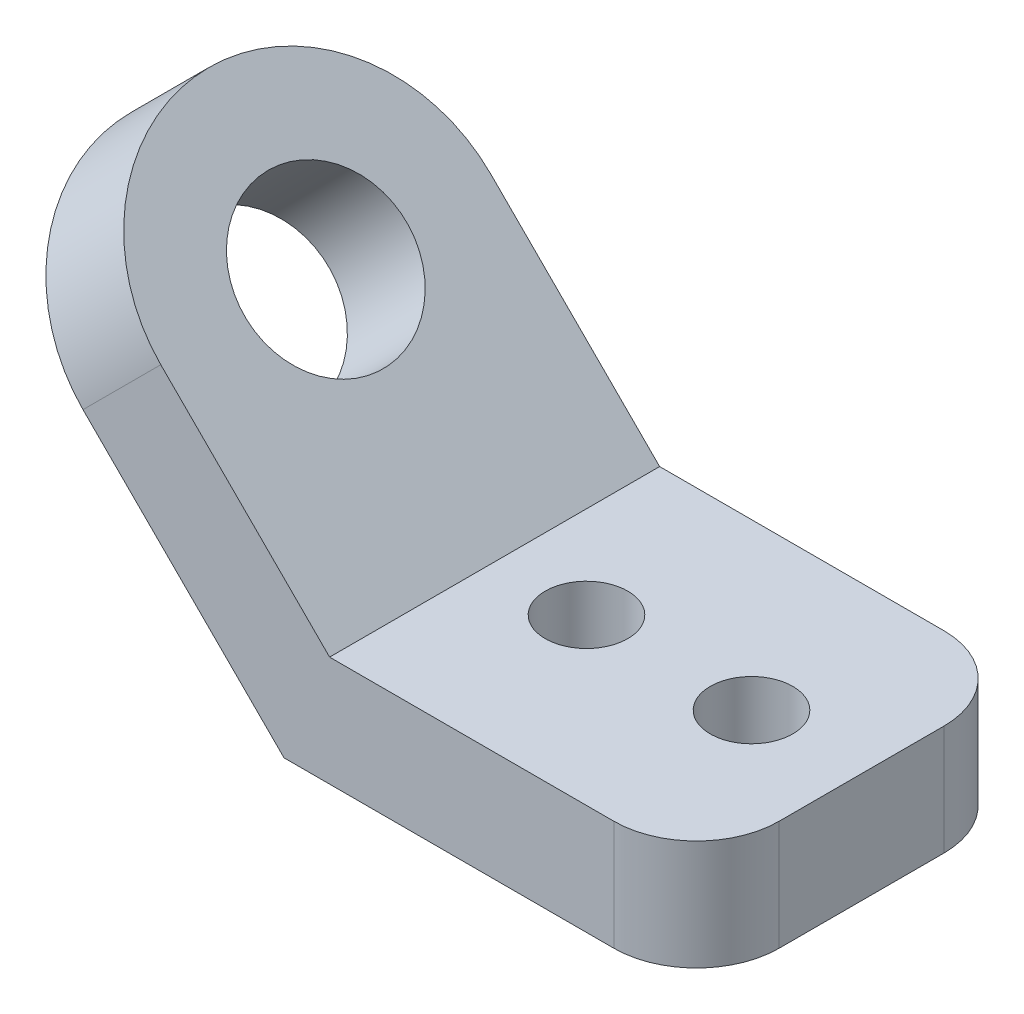
ISO-10303-21;
HEADER;
FILE_DESCRIPTION(('STEP AP214'),'2;1');
FILE_NAME('part.step','',(''),(''),'','','');
FILE_SCHEMA(('AUTOMOTIVE_DESIGN { 1 0 10303 214 1 1 1 1 }'));
ENDSEC;
DATA;
#1=APPLICATION_CONTEXT('core data for automotive mechanical design processes');
#2=APPLICATION_PROTOCOL_DEFINITION('international standard','automotive_design',2000,#1);
#3=PRODUCT_CONTEXT('',#1,'mechanical');
#4=PRODUCT('Part','Part','',(#3));
#5=PRODUCT_RELATED_PRODUCT_CATEGORY('part','',(#4));
#6=PRODUCT_DEFINITION_FORMATION('','',#4);
#7=PRODUCT_DEFINITION_CONTEXT('part definition',#1,'design');
#8=PRODUCT_DEFINITION('design','',#6,#7);
#9=PRODUCT_DEFINITION_SHAPE('','',#8);
#10=(LENGTH_UNIT() NAMED_UNIT(*) SI_UNIT(.MILLI.,.METRE.));
#11=(NAMED_UNIT(*) PLANE_ANGLE_UNIT() SI_UNIT($,.RADIAN.));
#12=(NAMED_UNIT(*) SI_UNIT($,.STERADIAN.) SOLID_ANGLE_UNIT());
#13=UNCERTAINTY_MEASURE_WITH_UNIT(LENGTH_MEASURE(1.E-05),#10,'distance_accuracy_value','');
#14=(GEOMETRIC_REPRESENTATION_CONTEXT(3) GLOBAL_UNCERTAINTY_ASSIGNED_CONTEXT((#13)) GLOBAL_UNIT_ASSIGNED_CONTEXT((#10,
#11,#12)) REPRESENTATION_CONTEXT('',''));
#15=CARTESIAN_POINT('',(0.,0.,0.));
#16=DIRECTION('',(0.,0.,1.));
#17=DIRECTION('',(1.,0.,0.));
#18=AXIS2_PLACEMENT_3D('',#15,#16,#17);
#19=CARTESIAN_POINT('',(0.,2.,3.));
#20=DIRECTION('',(-1.,0.,0.));
#21=DIRECTION('',(0.,0.,1.));
#22=AXIS2_PLACEMENT_3D('',#19,#20,#21);
#23=PLANE('',#22);
#24=DIRECTION('',(0.,0.,-1.));
#25=VECTOR('',#24,1.);
#26=CARTESIAN_POINT('',(0.,0.,3.));
#27=LINE('',#26,#25);
#28=CARTESIAN_POINT('',(0.,0.,1.5));
#29=VERTEX_POINT('',#28);
#30=CARTESIAN_POINT('',(0.,0.,-1.5));
#31=VERTEX_POINT('',#30);
#32=EDGE_CURVE('E145',#29,#31,#27,.T.);
#33=ORIENTED_EDGE('',*,*,#32,.T.);
#34=DIRECTION('',(0.,1.,0.));
#35=VECTOR('',#34,1.);
#36=CARTESIAN_POINT('',(0.,2.,-1.5));
#37=LINE('',#36,#35);
#38=CARTESIAN_POINT('',(0.,2.,-1.5));
#39=VERTEX_POINT('',#38);
#40=EDGE_CURVE('E174',#31,#39,#37,.T.);
#41=ORIENTED_EDGE('',*,*,#40,.T.);
#42=DIRECTION('',(0.,0.,-1.));
#43=VECTOR('',#42,1.);
#44=CARTESIAN_POINT('',(0.,2.,3.));
#45=LINE('',#44,#43);
#46=CARTESIAN_POINT('',(0.,2.,1.5));
#47=VERTEX_POINT('',#46);
#48=EDGE_CURVE('E132',#47,#39,#45,.T.);
#49=ORIENTED_EDGE('',*,*,#48,.F.);
#50=DIRECTION('',(0.,1.,0.));
#51=VECTOR('',#50,1.);
#52=CARTESIAN_POINT('',(0.,2.,1.5));
#53=LINE('',#52,#51);
#54=EDGE_CURVE('E170',#47,#29,#53,.F.);
#55=ORIENTED_EDGE('',*,*,#54,.T.);
#56=EDGE_LOOP('',(#33,#41,#49,#55));
#57=FACE_BOUND('',#56,.T.);
#58=ADVANCED_FACE('F38',(#57),#23,.F.);
#59=CARTESIAN_POINT('',(0.,2.,3.));
#60=DIRECTION('',(0.,-1.,0.));
#61=DIRECTION('',(1.,0.,0.));
#62=AXIS2_PLACEMENT_3D('',#59,#60,#61);
#63=PLANE('',#62);
#64=CARTESIAN_POINT('',(-5.,2.,0.));
#65=DIRECTION('',(0.,1.,0.));
#66=DIRECTION('',(-1.,0.,0.));
#67=AXIS2_PLACEMENT_3D('',#64,#65,#66);
#68=CIRCLE('',#67,0.749999999999999);
#69=CARTESIAN_POINT('',(-5.75,2.,0.));
#70=VERTEX_POINT('',#69);
#71=EDGE_CURVE('E251',#70,#70,#68,.T.);
#72=ORIENTED_EDGE('',*,*,#71,.F.);
#73=EDGE_LOOP('',(#72));
#74=FACE_BOUND('',#73,.T.);
#75=CARTESIAN_POINT('',(-2.,2.,0.));
#76=DIRECTION('',(0.,1.,0.));
#77=DIRECTION('',(-1.,0.,0.));
#78=AXIS2_PLACEMENT_3D('',#75,#76,#77);
#79=CIRCLE('',#78,0.750000000000001);
#80=CARTESIAN_POINT('',(-2.75,2.,0.));
#81=VERTEX_POINT('',#80);
#82=EDGE_CURVE('E254',#81,#81,#79,.T.);
#83=ORIENTED_EDGE('',*,*,#82,.F.);
#84=EDGE_LOOP('',(#83));
#85=FACE_BOUND('',#84,.T.);
#86=ORIENTED_EDGE('',*,*,#48,.T.);
#87=CARTESIAN_POINT('',(-1.5,2.,-1.5));
#88=DIRECTION('',(0.,-1.,0.));
#89=DIRECTION('',(1.,0.,0.));
#90=AXIS2_PLACEMENT_3D('',#87,#88,#89);
#91=CIRCLE('',#90,1.5);
#92=CARTESIAN_POINT('',(-1.5,2.,-3.));
#93=VERTEX_POINT('',#92);
#94=EDGE_CURVE('E179',#39,#93,#91,.F.);
#95=ORIENTED_EDGE('',*,*,#94,.T.);
#96=DIRECTION('',(-1.,0.,0.));
#97=VECTOR('',#96,1.);
#98=CARTESIAN_POINT('',(0.,2.,-3.));
#99=LINE('',#98,#97);
#100=CARTESIAN_POINT('',(-6.67,2.,-3.));
#101=VERTEX_POINT('',#100);
#102=EDGE_CURVE('E128',#93,#101,#99,.T.);
#103=ORIENTED_EDGE('',*,*,#102,.T.);
#104=DIRECTION('',(0.,0.,-1.));
#105=VECTOR('',#104,1.);
#106=CARTESIAN_POINT('',(-6.67,2.,3.));
#107=LINE('',#106,#105);
#108=CARTESIAN_POINT('',(-6.67,2.,3.));
#109=VERTEX_POINT('',#108);
#110=EDGE_CURVE('E125',#109,#101,#107,.T.);
#111=ORIENTED_EDGE('',*,*,#110,.F.);
#112=DIRECTION('',(-1.,0.,0.));
#113=VECTOR('',#112,1.);
#114=CARTESIAN_POINT('',(0.,2.,3.));
#115=LINE('',#114,#113);
#116=CARTESIAN_POINT('',(-1.5,2.,3.));
#117=VERTEX_POINT('',#116);
#118=EDGE_CURVE('E114',#117,#109,#115,.T.);
#119=ORIENTED_EDGE('',*,*,#118,.F.);
#120=CARTESIAN_POINT('',(-1.5,2.,1.5));
#121=DIRECTION('',(0.,-1.,0.));
#122=DIRECTION('',(1.,0.,0.));
#123=AXIS2_PLACEMENT_3D('',#120,#121,#122);
#124=CIRCLE('',#123,1.5);
#125=EDGE_CURVE('E177',#117,#47,#124,.F.);
#126=ORIENTED_EDGE('',*,*,#125,.T.);
#127=EDGE_LOOP('',(#86,#95,#103,#111,#119,#126));
#128=FACE_BOUND('',#127,.T.);
#129=ADVANCED_FACE('F127',(#74,#85,#128),#63,.F.);
#130=CARTESIAN_POINT('',(-6.67,2.,3.));
#131=DIRECTION('',(-0.707106781186548,-0.707106781186547,0.));
#132=DIRECTION('',(0.707106781186547,-0.707106781186548,0.));
#133=AXIS2_PLACEMENT_3D('',#130,#131,#132);
#134=PLANE('',#133);
#135=CARTESIAN_POINT('',(-9.73884343034961,5.06884343034962,0.));
#136=DIRECTION('',(0.707106781186548,0.707106781186547,0.));
#137=DIRECTION('',(-0.707106781186547,0.707106781186548,0.));
#138=AXIS2_PLACEMENT_3D('',#135,#136,#137);
#139=CIRCLE('',#138,1.475);
#140=CARTESIAN_POINT('',(-10.7818259325998,6.11182593259978,0.));
#141=VERTEX_POINT('',#140);
#142=EDGE_CURVE('E247',#141,#141,#139,.T.);
#143=ORIENTED_EDGE('',*,*,#142,.F.);
#144=EDGE_LOOP('',(#143));
#145=FACE_BOUND('',#144,.T.);
#146=DIRECTION('',(-0.707106781186547,0.707106781186549,0.));
#147=VECTOR('',#146,1.);
#148=CARTESIAN_POINT('',(-6.67,2.,-3.));
#149=LINE('',#148,#147);
#150=CARTESIAN_POINT('',(-9.73884343034961,5.06884343034962,-3.));
#151=VERTEX_POINT('',#150);
#152=EDGE_CURVE('E147',#101,#151,#149,.T.);
#153=ORIENTED_EDGE('',*,*,#152,.T.);
#154=CARTESIAN_POINT('',(-9.73884343034961,5.06884343034962,0.));
#155=DIRECTION('',(-0.707106781186548,-0.707106781186547,0.));
#156=DIRECTION('',(0.707106781186547,-0.707106781186548,0.));
#157=AXIS2_PLACEMENT_3D('',#154,#155,#156);
#158=CIRCLE('',#157,3.);
#159=CARTESIAN_POINT('',(-11.8601637739093,7.19016377390926,0.));
#160=VERTEX_POINT('',#159);
#161=EDGE_CURVE('E166',#151,#160,#158,.F.);
#162=ORIENTED_EDGE('',*,*,#161,.T.);
#163=CARTESIAN_POINT('',(-9.73884343034961,5.06884343034962,0.));
#164=DIRECTION('',(-0.707106781186548,-0.707106781186547,0.));
#165=DIRECTION('',(0.707106781186547,-0.707106781186548,0.));
#166=AXIS2_PLACEMENT_3D('',#163,#164,#165);
#167=CIRCLE('',#166,3.);
#168=CARTESIAN_POINT('',(-9.73884343034961,5.06884343034962,3.));
#169=VERTEX_POINT('',#168);
#170=EDGE_CURVE('E137',#160,#169,#167,.F.);
#171=ORIENTED_EDGE('',*,*,#170,.T.);
#172=DIRECTION('',(-0.707106781186547,0.707106781186549,0.));
#173=VECTOR('',#172,1.);
#174=CARTESIAN_POINT('',(-6.67,2.,3.));
#175=LINE('',#174,#173);
#176=EDGE_CURVE('E118',#109,#169,#175,.T.);
#177=ORIENTED_EDGE('',*,*,#176,.F.);
#178=ORIENTED_EDGE('',*,*,#110,.T.);
#179=EDGE_LOOP('',(#153,#162,#171,#177,#178));
#180=FACE_BOUND('',#179,.T.);
#181=ADVANCED_FACE('F135',(#145,#180),#134,.F.);
#182=CARTESIAN_POINT('',(-7.49842712474619,0.,3.));
#183=DIRECTION('',(0.707106781186548,0.707106781186546,0.));
#184=DIRECTION('',(-0.707106781186546,0.707106781186549,0.));
#185=AXIS2_PLACEMENT_3D('',#182,#183,#184);
#186=PLANE('',#185);
#187=CARTESIAN_POINT('',(-11.1530569927227,3.65462986797652,0.));
#188=DIRECTION('',(0.707106781186548,0.707106781186546,0.));
#189=DIRECTION('',(-0.707106781186546,0.707106781186549,0.));
#190=AXIS2_PLACEMENT_3D('',#187,#188,#189);
#191=CIRCLE('',#190,1.475);
#192=CARTESIAN_POINT('',(-12.1960394949729,4.69761237022668,0.));
#193=VERTEX_POINT('',#192);
#194=EDGE_CURVE('E42',#193,#193,#191,.T.);
#195=ORIENTED_EDGE('',*,*,#194,.T.);
#196=EDGE_LOOP('',(#195));
#197=FACE_BOUND('',#196,.T.);
#198=CARTESIAN_POINT('',(-11.1530569927227,3.65462986797653,0.));
#199=DIRECTION('',(0.707106781186548,0.707106781186546,0.));
#200=DIRECTION('',(-0.707106781186546,0.707106781186549,0.));
#201=AXIS2_PLACEMENT_3D('',#198,#199,#200);
#202=CIRCLE('',#201,3.);
#203=CARTESIAN_POINT('',(-11.1530569927227,3.65462986797653,3.));
#204=VERTEX_POINT('',#203);
#205=CARTESIAN_POINT('',(-13.2743773362823,5.77595021153617,0.));
#206=VERTEX_POINT('',#205);
#207=EDGE_CURVE('E158',#204,#206,#202,.F.);
#208=ORIENTED_EDGE('',*,*,#207,.T.);
#209=CARTESIAN_POINT('',(-11.1530569927227,3.65462986797653,0.));
#210=DIRECTION('',(0.707106781186548,0.707106781186546,0.));
#211=DIRECTION('',(-0.707106781186546,0.707106781186549,0.));
#212=AXIS2_PLACEMENT_3D('',#209,#210,#211);
#213=CIRCLE('',#212,3.);
#214=CARTESIAN_POINT('',(-11.1530569927227,3.65462986797653,-3.));
#215=VERTEX_POINT('',#214);
#216=EDGE_CURVE('E160',#206,#215,#213,.F.);
#217=ORIENTED_EDGE('',*,*,#216,.T.);
#218=DIRECTION('',(0.707106781186546,-0.707106781186549,0.));
#219=VECTOR('',#218,1.);
#220=CARTESIAN_POINT('',(-7.49842712474619,0.,-3.));
#221=LINE('',#220,#219);
#222=CARTESIAN_POINT('',(-7.49842712474619,0.,-3.));
#223=VERTEX_POINT('',#222);
#224=EDGE_CURVE('E150',#215,#223,#221,.T.);
#225=ORIENTED_EDGE('',*,*,#224,.T.);
#226=DIRECTION('',(0.,0.,-1.));
#227=VECTOR('',#226,1.);
#228=CARTESIAN_POINT('',(-7.49842712474619,0.,3.));
#229=LINE('',#228,#227);
#230=CARTESIAN_POINT('',(-7.49842712474619,0.,3.));
#231=VERTEX_POINT('',#230);
#232=EDGE_CURVE('E133',#231,#223,#229,.T.);
#233=ORIENTED_EDGE('',*,*,#232,.F.);
#234=DIRECTION('',(0.707106781186546,-0.707106781186549,0.));
#235=VECTOR('',#234,1.);
#236=CARTESIAN_POINT('',(-7.49842712474619,0.,3.));
#237=LINE('',#236,#235);
#238=EDGE_CURVE('E138',#204,#231,#237,.T.);
#239=ORIENTED_EDGE('',*,*,#238,.F.);
#240=EDGE_LOOP('',(#208,#217,#225,#233,#239));
#241=FACE_BOUND('',#240,.T.);
#242=ADVANCED_FACE('F202',(#197,#241),#186,.F.);
#243=CARTESIAN_POINT('',(0.,0.,3.));
#244=DIRECTION('',(0.,1.,0.));
#245=DIRECTION('',(-1.,0.,0.));
#246=AXIS2_PLACEMENT_3D('',#243,#244,#245);
#247=PLANE('',#246);
#248=CARTESIAN_POINT('',(-5.,0.,0.));
#249=DIRECTION('',(0.,1.,0.));
#250=DIRECTION('',(-1.,0.,0.));
#251=AXIS2_PLACEMENT_3D('',#248,#249,#250);
#252=CIRCLE('',#251,0.749999999999999);
#253=CARTESIAN_POINT('',(-5.75,0.,0.));
#254=VERTEX_POINT('',#253);
#255=EDGE_CURVE('E248',#254,#254,#252,.T.);
#256=ORIENTED_EDGE('',*,*,#255,.T.);
#257=EDGE_LOOP('',(#256));
#258=FACE_BOUND('',#257,.T.);
#259=CARTESIAN_POINT('',(-2.,0.,0.));
#260=DIRECTION('',(0.,1.,0.));
#261=DIRECTION('',(-1.,0.,0.));
#262=AXIS2_PLACEMENT_3D('',#259,#260,#261);
#263=CIRCLE('',#262,0.750000000000001);
#264=CARTESIAN_POINT('',(-2.75,0.,0.));
#265=VERTEX_POINT('',#264);
#266=EDGE_CURVE('E257',#265,#265,#263,.T.);
#267=ORIENTED_EDGE('',*,*,#266,.T.);
#268=EDGE_LOOP('',(#267));
#269=FACE_BOUND('',#268,.T.);
#270=DIRECTION('',(1.,0.,0.));
#271=VECTOR('',#270,1.);
#272=CARTESIAN_POINT('',(0.,0.,-3.));
#273=LINE('',#272,#271);
#274=CARTESIAN_POINT('',(-1.5,0.,-3.));
#275=VERTEX_POINT('',#274);
#276=EDGE_CURVE('E122',#223,#275,#273,.T.);
#277=ORIENTED_EDGE('',*,*,#276,.T.);
#278=CARTESIAN_POINT('',(-1.5,0.,-1.5));
#279=DIRECTION('',(0.,1.,0.));
#280=DIRECTION('',(-1.,0.,0.));
#281=AXIS2_PLACEMENT_3D('',#278,#279,#280);
#282=CIRCLE('',#281,1.5);
#283=EDGE_CURVE('E47',#275,#31,#282,.F.);
#284=ORIENTED_EDGE('',*,*,#283,.T.);
#285=ORIENTED_EDGE('',*,*,#32,.F.);
#286=CARTESIAN_POINT('',(-1.5,0.,1.5));
#287=DIRECTION('',(0.,1.,0.));
#288=DIRECTION('',(-1.,0.,0.));
#289=AXIS2_PLACEMENT_3D('',#286,#287,#288);
#290=CIRCLE('',#289,1.5);
#291=CARTESIAN_POINT('',(-1.5,0.,3.));
#292=VERTEX_POINT('',#291);
#293=EDGE_CURVE('E54',#29,#292,#290,.F.);
#294=ORIENTED_EDGE('',*,*,#293,.T.);
#295=DIRECTION('',(1.,0.,0.));
#296=VECTOR('',#295,1.);
#297=CARTESIAN_POINT('',(0.,0.,3.));
#298=LINE('',#297,#296);
#299=EDGE_CURVE('E140',#231,#292,#298,.T.);
#300=ORIENTED_EDGE('',*,*,#299,.F.);
#301=ORIENTED_EDGE('',*,*,#232,.T.);
#302=EDGE_LOOP('',(#277,#284,#285,#294,#300,#301));
#303=FACE_BOUND('',#302,.T.);
#304=ADVANCED_FACE('F184',(#258,#269,#303),#247,.F.);
#305=CARTESIAN_POINT('',(0.,0.,3.));
#306=DIRECTION('',(0.,0.,-1.));
#307=DIRECTION('',(-1.,0.,0.));
#308=AXIS2_PLACEMENT_3D('',#305,#306,#307);
#309=PLANE('',#308);
#310=ORIENTED_EDGE('',*,*,#299,.T.);
#311=DIRECTION('',(0.,1.,0.));
#312=VECTOR('',#311,1.);
#313=CARTESIAN_POINT('',(-1.5,0.,3.));
#314=LINE('',#313,#312);
#315=EDGE_CURVE('E11',#292,#117,#314,.T.);
#316=ORIENTED_EDGE('',*,*,#315,.T.);
#317=ORIENTED_EDGE('',*,*,#118,.T.);
#318=ORIENTED_EDGE('',*,*,#176,.T.);
#319=DIRECTION('',(-0.707106781186549,-0.707106781186546,0.));
#320=VECTOR('',#319,1.);
#321=CARTESIAN_POINT('',(-7.40384343034959,7.40384343034962,3.));
#322=LINE('',#321,#320);
#323=EDGE_CURVE('E168',#169,#204,#322,.T.);
#324=ORIENTED_EDGE('',*,*,#323,.T.);
#325=ORIENTED_EDGE('',*,*,#238,.T.);
#326=EDGE_LOOP('',(#310,#316,#317,#318,#324,#325));
#327=FACE_BOUND('',#326,.T.);
#328=ADVANCED_FACE('F116',(#327),#309,.F.);
#329=CARTESIAN_POINT('',(0.,0.,-3.));
#330=DIRECTION('',(0.,0.,-1.));
#331=DIRECTION('',(-1.,0.,0.));
#332=AXIS2_PLACEMENT_3D('',#329,#330,#331);
#333=PLANE('',#332);
#334=ORIENTED_EDGE('',*,*,#102,.F.);
#335=DIRECTION('',(0.,1.,0.));
#336=VECTOR('',#335,1.);
#337=CARTESIAN_POINT('',(-1.5,0.,-3.));
#338=LINE('',#337,#336);
#339=EDGE_CURVE('E62',#93,#275,#338,.F.);
#340=ORIENTED_EDGE('',*,*,#339,.T.);
#341=ORIENTED_EDGE('',*,*,#276,.F.);
#342=ORIENTED_EDGE('',*,*,#224,.F.);
#343=DIRECTION('',(-0.707106781186549,-0.707106781186546,0.));
#344=VECTOR('',#343,1.);
#345=CARTESIAN_POINT('',(-9.73884343034961,5.06884343034962,-3.));
#346=LINE('',#345,#344);
#347=EDGE_CURVE('E162',#215,#151,#346,.F.);
#348=ORIENTED_EDGE('',*,*,#347,.T.);
#349=ORIENTED_EDGE('',*,*,#152,.F.);
#350=EDGE_LOOP('',(#334,#340,#341,#342,#348,#349));
#351=FACE_BOUND('',#350,.T.);
#352=ADVANCED_FACE('F191',(#351),#333,.T.);
#353=CARTESIAN_POINT('',(-7.4038434303496,7.40384343034963,0.));
#354=DIRECTION('',(-0.707106781186549,-0.707106781186546,0.));
#355=DIRECTION('',(0.707106781186546,-0.707106781186549,0.));
#356=AXIS2_PLACEMENT_3D('',#353,#354,#355);
#357=CYLINDRICAL_SURFACE('',#356,3.);
#358=ORIENTED_EDGE('',*,*,#323,.F.);
#359=ORIENTED_EDGE('',*,*,#170,.F.);
#360=DIRECTION('',(-0.707106781186549,-0.707106781186546,0.));
#361=VECTOR('',#360,1.);
#362=CARTESIAN_POINT('',(-11.8601637739093,7.19016377390926,0.));
#363=LINE('',#362,#361);
#364=EDGE_CURVE('E148',#206,#160,#363,.F.);
#365=ORIENTED_EDGE('',*,*,#364,.F.);
#366=ORIENTED_EDGE('',*,*,#207,.F.);
#367=EDGE_LOOP('',(#358,#359,#365,#366));
#368=FACE_BOUND('',#367,.T.);
#369=ADVANCED_FACE('F197',(#368),#357,.T.);
#370=CARTESIAN_POINT('',(-9.73884343034961,5.06884343034962,0.));
#371=DIRECTION('',(0.707106781186549,0.707106781186546,0.));
#372=DIRECTION('',(-0.707106781186546,0.707106781186549,0.));
#373=AXIS2_PLACEMENT_3D('',#370,#371,#372);
#374=CYLINDRICAL_SURFACE('',#373,3.);
#375=ORIENTED_EDGE('',*,*,#161,.F.);
#376=ORIENTED_EDGE('',*,*,#347,.F.);
#377=ORIENTED_EDGE('',*,*,#216,.F.);
#378=ORIENTED_EDGE('',*,*,#364,.T.);
#379=EDGE_LOOP('',(#375,#376,#377,#378));
#380=FACE_BOUND('',#379,.T.);
#381=ADVANCED_FACE('F200',(#380),#374,.T.);
#382=CARTESIAN_POINT('',(-1.5,2.,-1.5));
#383=DIRECTION('',(0.,-1.,0.));
#384=DIRECTION('',(0.,0.,-1.));
#385=AXIS2_PLACEMENT_3D('',#382,#383,#384);
#386=CYLINDRICAL_SURFACE('',#385,1.5);
#387=ORIENTED_EDGE('',*,*,#283,.F.);
#388=ORIENTED_EDGE('',*,*,#339,.F.);
#389=ORIENTED_EDGE('',*,*,#94,.F.);
#390=ORIENTED_EDGE('',*,*,#40,.F.);
#391=EDGE_LOOP('',(#387,#388,#389,#390));
#392=FACE_BOUND('',#391,.T.);
#393=ADVANCED_FACE('F190',(#392),#386,.T.);
#394=CARTESIAN_POINT('',(-1.5,0.,1.5));
#395=DIRECTION('',(0.,1.,0.));
#396=DIRECTION('',(0.,0.,1.));
#397=AXIS2_PLACEMENT_3D('',#394,#395,#396);
#398=CYLINDRICAL_SURFACE('',#397,1.5);
#399=ORIENTED_EDGE('',*,*,#293,.F.);
#400=ORIENTED_EDGE('',*,*,#54,.F.);
#401=ORIENTED_EDGE('',*,*,#125,.F.);
#402=ORIENTED_EDGE('',*,*,#315,.F.);
#403=EDGE_LOOP('',(#399,#400,#401,#402));
#404=FACE_BOUND('',#403,.T.);
#405=ADVANCED_FACE('F40',(#404),#398,.T.);
#406=CARTESIAN_POINT('',(-14.0410320984908,0.766654762208445,0.));
#407=DIRECTION('',(0.707106781186548,0.707106781186547,0.));
#408=DIRECTION('',(-0.707106781186547,0.707106781186548,0.));
#409=AXIS2_PLACEMENT_3D('',#406,#407,#408);
#410=CYLINDRICAL_SURFACE('',#409,1.475);
#411=CARTESIAN_POINT('',(-10.7818259325998,6.11182593259978,0.));
#412=CARTESIAN_POINT('',(-10.7965573238745,6.09709454132506,0.));
#413=CARTESIAN_POINT('',(-10.8112887151492,6.08236315005034,0.));
#414=CARTESIAN_POINT('',(-10.8407514976986,6.0529003675009,0.));
#415=CARTESIAN_POINT('',(-10.8554828889734,6.03816897622618,0.));
#416=CARTESIAN_POINT('',(-10.8849456715228,6.00870619367674,0.));
#417=CARTESIAN_POINT('',(-10.8996770627975,5.99397480240202,0.));
#418=CARTESIAN_POINT('',(-10.929139845347,5.96451201985258,0.));
#419=CARTESIAN_POINT('',(-10.9438712366217,5.94978062857786,0.));
#420=CARTESIAN_POINT('',(-10.9733340191711,5.92031784602842,0.));
#421=CARTESIAN_POINT('',(-10.9880654104458,5.9055864547537,0.));
#422=CARTESIAN_POINT('',(-11.0175281929953,5.87612367220426,0.));
#423=CARTESIAN_POINT('',(-11.03225958427,5.86139228092954,0.));
#424=CARTESIAN_POINT('',(-11.0617223668194,5.8319294983801,0.));
#425=CARTESIAN_POINT('',(-11.0764537580942,5.81719810710538,0.));
#426=CARTESIAN_POINT('',(-11.1059165406436,5.78773532455594,0.));
#427=CARTESIAN_POINT('',(-11.1206479319183,5.77300393328122,0.));
#428=CARTESIAN_POINT('',(-11.1501107144678,5.74354115073178,0.));
#429=CARTESIAN_POINT('',(-11.1648421057425,5.72880975945706,0.));
#430=CARTESIAN_POINT('',(-11.1943048882919,5.69934697690762,0.));
#431=CARTESIAN_POINT('',(-11.2090362795666,5.6846155856329,0.));
#432=CARTESIAN_POINT('',(-11.2384990621161,5.65515280308347,0.));
#433=CARTESIAN_POINT('',(-11.2532304533908,5.64042141180874,0.));
#434=CARTESIAN_POINT('',(-11.2826932359402,5.61095862925931,0.));
#435=CARTESIAN_POINT('',(-11.297424627215,5.59622723798459,0.));
#436=CARTESIAN_POINT('',(-11.3268874097644,5.56676445543515,0.));
#437=CARTESIAN_POINT('',(-11.3416188010391,5.55203306416043,0.));
#438=CARTESIAN_POINT('',(-11.3710815835886,5.52257028161099,0.));
#439=CARTESIAN_POINT('',(-11.3858129748633,5.50783889033627,0.));
#440=CARTESIAN_POINT('',(-11.4152757574127,5.47837610778683,0.));
#441=CARTESIAN_POINT('',(-11.4300071486874,5.46364471651211,0.));
#442=CARTESIAN_POINT('',(-11.4594699312369,5.43418193396267,0.));
#443=CARTESIAN_POINT('',(-11.4742013225116,5.41945054268795,0.));
#444=CARTESIAN_POINT('',(-11.503664105061,5.38998776013851,0.));
#445=CARTESIAN_POINT('',(-11.5183954963358,5.37525636886379,0.));
#446=CARTESIAN_POINT('',(-11.5478582788852,5.34579358631435,0.));
#447=CARTESIAN_POINT('',(-11.5625896701599,5.33106219503963,0.));
#448=CARTESIAN_POINT('',(-11.5920524527094,5.30159941249019,0.));
#449=CARTESIAN_POINT('',(-11.6067838439841,5.28686802121547,0.));
#450=CARTESIAN_POINT('',(-11.6362466265335,5.25740523866603,0.));
#451=CARTESIAN_POINT('',(-11.6509780178082,5.24267384739131,0.));
#452=CARTESIAN_POINT('',(-11.6804408003577,5.21321106484187,0.));
#453=CARTESIAN_POINT('',(-11.6951721916324,5.19847967356715,0.));
#454=CARTESIAN_POINT('',(-11.7246349741818,5.16901689101771,0.));
#455=CARTESIAN_POINT('',(-11.7393663654566,5.15428549974299,0.));
#456=CARTESIAN_POINT('',(-11.768829148006,5.12482271719356,0.));
#457=CARTESIAN_POINT('',(-11.7835605392807,5.11009132591883,0.));
#458=CARTESIAN_POINT('',(-11.8130233218301,5.0806285433694,0.));
#459=CARTESIAN_POINT('',(-11.8277547131049,5.06589715209468,0.));
#460=CARTESIAN_POINT('',(-11.8572174956543,5.03643436954524,0.));
#461=CARTESIAN_POINT('',(-11.871948886929,5.02170297827052,0.));
#462=CARTESIAN_POINT('',(-11.9014116694785,4.99224019572108,0.));
#463=CARTESIAN_POINT('',(-11.9161430607532,4.97750880444636,0.));
#464=CARTESIAN_POINT('',(-11.9456058433026,4.94804602189692,0.));
#465=CARTESIAN_POINT('',(-11.9603372345773,4.9333146306222,0.));
#466=CARTESIAN_POINT('',(-11.9898000171268,4.90385184807276,0.));
#467=CARTESIAN_POINT('',(-12.0045314084015,4.88912045679804,0.));
#468=CARTESIAN_POINT('',(-12.0339941909509,4.8596576742486,0.));
#469=CARTESIAN_POINT('',(-12.0487255822257,4.84492628297388,0.));
#470=CARTESIAN_POINT('',(-12.0781883647751,4.81546350042444,0.));
#471=CARTESIAN_POINT('',(-12.0929197560498,4.80073210914972,0.));
#472=CARTESIAN_POINT('',(-12.1223825385993,4.77126932660028,0.));
#473=CARTESIAN_POINT('',(-12.137113929874,4.75653793532556,0.));
#474=CARTESIAN_POINT('',(-12.1665767124234,4.72707515277612,0.));
#475=CARTESIAN_POINT('',(-12.1813081036981,4.7123437615014,0.));
#476=CARTESIAN_POINT('',(-12.1960394949729,4.69761237022668,0.));
#477=B_SPLINE_CURVE_WITH_KNOTS('',3,(#411,#412,#413,#414,#415,#416,#417,#418,#419,#420,#421,
#422,#423,#424,#425,#426,#427,#428,#429,#430,#431,#432,#433,#434,#435,#436,#437,#438,#439,#440,
#441,#442,#443,#444,#445,#446,#447,#448,#449,#450,#451,#452,#453,#454,#455,#456,#457,#458,#459,
#460,#461,#462,#463,#464,#465,#466,#467,#468,#469,#470,#471,#472,#473,#474,#475,#476),
.UNSPECIFIED.,.F.,.F.,(4,2,2,2,2,2,2,2,2,2,2,2,2,2,2,2,2,2,2,2,2,2,2,2,2,2,2,2,2,2,2,2,4),(0.,
0.062500000000001,0.125,0.187500000000001,0.250000000000001,0.312500000000001,0.375000000000002,
0.4375,0.500000000000002,0.562500000000002,0.625000000000001,0.687500000000001,
0.750000000000001,0.812500000000001,0.875000000000001,0.9375,1.,1.0625,1.125,1.1875,1.25,1.3125,
1.375,1.4375,1.5,1.5625,1.625,1.6875,1.75,1.8125,1.875,1.9375,2.),.UNSPECIFIED.);
#478=EDGE_CURVE('BSEAM207',#141,#193,#477,.T.);
#479=ORIENTED_EDGE('',*,*,#142,.T.);
#480=ORIENTED_EDGE('',*,*,#194,.F.);
#481=ORIENTED_EDGE('',*,*,#478,.T.);
#482=ORIENTED_EDGE('',*,*,#478,.F.);
#483=EDGE_LOOP('',(#479,#481,#480,#482));
#484=FACE_BOUND('',#483,.T.);
#485=ADVANCED_FACE('F207',(#484),#410,.F.);
#486=CARTESIAN_POINT('',(-2.,0.,0.));
#487=DIRECTION('',(0.,1.,0.));
#488=DIRECTION('',(-1.,0.,0.));
#489=AXIS2_PLACEMENT_3D('',#486,#487,#488);
#490=CYLINDRICAL_SURFACE('',#489,0.750000000000001);
#491=ORIENTED_EDGE('',*,*,#266,.F.);
#492=EDGE_LOOP('',(#491));
#493=FACE_BOUND('',#492,.T.);
#494=ORIENTED_EDGE('',*,*,#82,.T.);
#495=EDGE_LOOP('',(#494));
#496=FACE_BOUND('',#495,.T.);
#497=ADVANCED_FACE('F212',(#493,#496),#490,.F.);
#498=CARTESIAN_POINT('',(-5.,0.,0.));
#499=DIRECTION('',(0.,1.,0.));
#500=DIRECTION('',(-1.,0.,0.));
#501=AXIS2_PLACEMENT_3D('',#498,#499,#500);
#502=CYLINDRICAL_SURFACE('',#501,0.749999999999999);
#503=ORIENTED_EDGE('',*,*,#255,.F.);
#504=EDGE_LOOP('',(#503));
#505=FACE_BOUND('',#504,.T.);
#506=ORIENTED_EDGE('',*,*,#71,.T.);
#507=EDGE_LOOP('',(#506));
#508=FACE_BOUND('',#507,.T.);
#509=ADVANCED_FACE('F263',(#505,#508),#502,.F.);
#510=CLOSED_SHELL('',(#58,#129,#181,#242,#304,#328,#352,#369,#381,#393,#405,#485,#497,#509));
#511=MANIFOLD_SOLID_BREP('B2',#510);
#512=ADVANCED_BREP_SHAPE_REPRESENTATION('',(#18,#511),#14);
#513=SHAPE_DEFINITION_REPRESENTATION(#9,#512);
ENDSEC;
END-ISO-10303-21;
